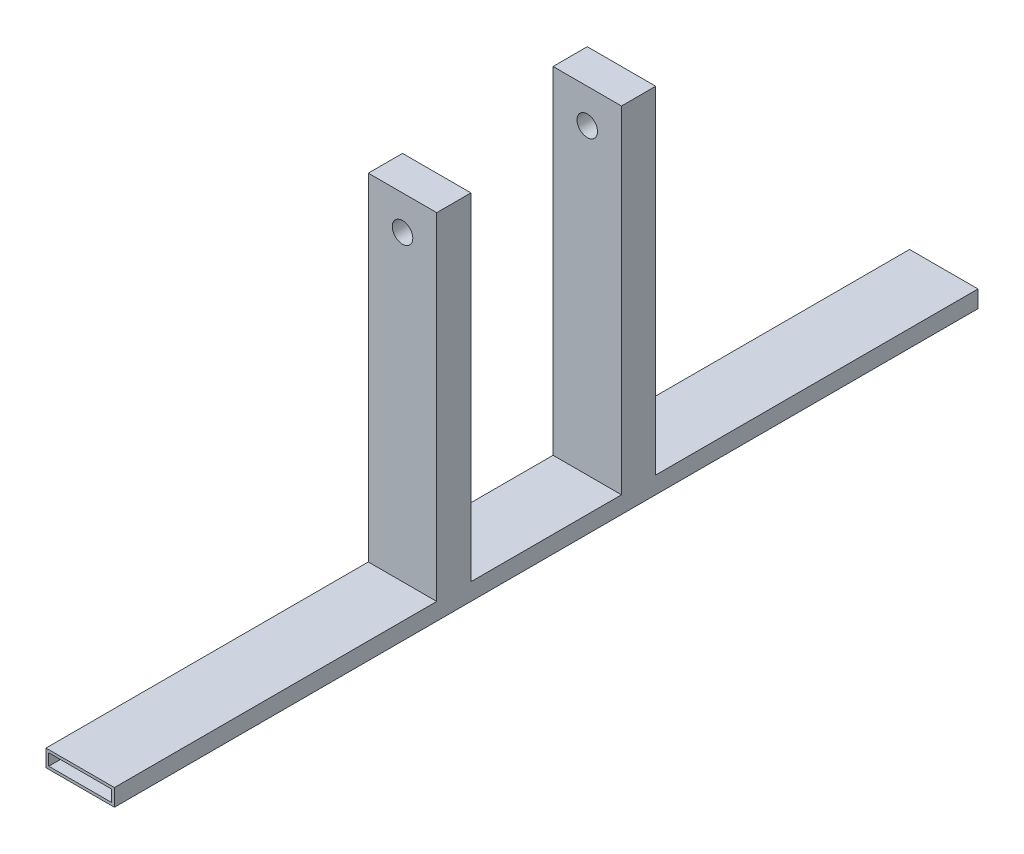
ISO-10303-21;
HEADER;
FILE_DESCRIPTION(('STEP AP214'),'2;1');
FILE_NAME('part.step','',(''),(''),'','','');
FILE_SCHEMA(('AUTOMOTIVE_DESIGN { 1 0 10303 214 1 1 1 1 }'));
ENDSEC;
DATA;
#1=APPLICATION_CONTEXT('core data for automotive mechanical design processes');
#2=APPLICATION_PROTOCOL_DEFINITION('international standard','automotive_design',2000,#1);
#3=PRODUCT_CONTEXT('',#1,'mechanical');
#4=PRODUCT('Part','Part','',(#3));
#5=PRODUCT_RELATED_PRODUCT_CATEGORY('part','',(#4));
#6=PRODUCT_DEFINITION_FORMATION('','',#4);
#7=PRODUCT_DEFINITION_CONTEXT('part definition',#1,'design');
#8=PRODUCT_DEFINITION('design','',#6,#7);
#9=PRODUCT_DEFINITION_SHAPE('','',#8);
#10=(LENGTH_UNIT() NAMED_UNIT(*) SI_UNIT(.MILLI.,.METRE.));
#11=(NAMED_UNIT(*) PLANE_ANGLE_UNIT() SI_UNIT($,.RADIAN.));
#12=(NAMED_UNIT(*) SI_UNIT($,.STERADIAN.) SOLID_ANGLE_UNIT());
#13=UNCERTAINTY_MEASURE_WITH_UNIT(LENGTH_MEASURE(1.E-05),#10,'distance_accuracy_value','');
#14=(GEOMETRIC_REPRESENTATION_CONTEXT(3) GLOBAL_UNCERTAINTY_ASSIGNED_CONTEXT((#13)) GLOBAL_UNIT_ASSIGNED_CONTEXT((#10,
#11,#12)) REPRESENTATION_CONTEXT('',''));
#15=CARTESIAN_POINT('',(0.,0.,0.));
#16=DIRECTION('',(0.,0.,1.));
#17=DIRECTION('',(1.,0.,0.));
#18=AXIS2_PLACEMENT_3D('',#15,#16,#17);
#19=CARTESIAN_POINT('',(-16.6040623260991,3.95833333333333,631.));
#20=DIRECTION('',(0.,-1.,0.));
#21=DIRECTION('',(0.,0.,-1.));
#22=AXIS2_PLACEMENT_3D('',#19,#20,#21);
#23=PLANE('',#22);
#24=DIRECTION('',(1.,0.,0.));
#25=VECTOR('',#24,1.);
#26=CARTESIAN_POINT('',(-16.6040623260991,3.95833333333333,395.5));
#27=LINE('',#26,#25);
#28=CARTESIAN_POINT('',(-16.6040623260991,3.95833333333333,395.5));
#29=VERTEX_POINT('',#28);
#30=CARTESIAN_POINT('',(33.395937673901,3.95833333333333,395.5));
#31=VERTEX_POINT('',#30);
#32=EDGE_CURVE('E59',#29,#31,#27,.T.);
#33=ORIENTED_EDGE('',*,*,#32,.F.);
#34=DIRECTION('',(0.,0.,-1.));
#35=VECTOR('',#34,1.);
#36=CARTESIAN_POINT('',(-16.6040623260991,3.95833333333333,631.));
#37=LINE('',#36,#35);
#38=CARTESIAN_POINT('',(-16.6040623260991,3.95833333333333,631.));
#39=VERTEX_POINT('',#38);
#40=EDGE_CURVE('E221',#39,#29,#37,.T.);
#41=ORIENTED_EDGE('',*,*,#40,.F.);
#42=DIRECTION('',(-1.,0.,0.));
#43=VECTOR('',#42,1.);
#44=CARTESIAN_POINT('',(-16.6040623260991,3.95833333333333,631.));
#45=LINE('',#44,#43);
#46=CARTESIAN_POINT('',(33.395937673901,3.95833333333333,631.));
#47=VERTEX_POINT('',#46);
#48=EDGE_CURVE('E346',#47,#39,#45,.T.);
#49=ORIENTED_EDGE('',*,*,#48,.F.);
#50=DIRECTION('',(0.,0.,-1.));
#51=VECTOR('',#50,1.);
#52=CARTESIAN_POINT('',(33.395937673901,3.95833333333333,631.));
#53=LINE('',#52,#51);
#54=EDGE_CURVE('E361',#47,#31,#53,.T.);
#55=ORIENTED_EDGE('',*,*,#54,.T.);
#56=EDGE_LOOP('',(#33,#41,#49,#55));
#57=FACE_BOUND('',#56,.T.);
#58=ADVANCED_FACE('F35',(#57),#23,.F.);
#59=DIRECTION('',(-1.,0.,0.));
#60=VECTOR('',#59,1.);
#61=CARTESIAN_POINT('',(-16.6040623260991,3.95833333333333,370.5));
#62=LINE('',#61,#60);
#63=CARTESIAN_POINT('',(33.395937673901,3.95833333333333,370.5));
#64=VERTEX_POINT('',#63);
#65=CARTESIAN_POINT('',(-16.6040623260976,3.95833333333331,370.5));
#66=VERTEX_POINT('',#65);
#67=EDGE_CURVE('E239',#64,#66,#62,.T.);
#68=ORIENTED_EDGE('',*,*,#67,.F.);
#69=CARTESIAN_POINT('',(33.395937673901,3.95833333333333,260.5));
#70=VERTEX_POINT('',#69);
#71=EDGE_CURVE('E364',#64,#70,#53,.T.);
#72=ORIENTED_EDGE('',*,*,#71,.T.);
#73=DIRECTION('',(1.,0.,0.));
#74=VECTOR('',#73,1.);
#75=CARTESIAN_POINT('',(-16.6040623260991,3.95833333333333,260.5));
#76=LINE('',#75,#74);
#77=CARTESIAN_POINT('',(-16.6040623260991,3.95833333333333,260.5));
#78=VERTEX_POINT('',#77);
#79=EDGE_CURVE('E294',#78,#70,#76,.T.);
#80=ORIENTED_EDGE('',*,*,#79,.F.);
#81=EDGE_CURVE('E360',#66,#78,#37,.T.);
#82=ORIENTED_EDGE('',*,*,#81,.F.);
#83=EDGE_LOOP('',(#68,#72,#80,#82));
#84=FACE_BOUND('',#83,.T.);
#85=ADVANCED_FACE('F436',(#84),#23,.F.);
#86=CARTESIAN_POINT('',(-14.6040623260991,3.95833333333333,631.));
#87=DIRECTION('',(1.,0.,0.));
#88=DIRECTION('',(0.,0.,-1.));
#89=AXIS2_PLACEMENT_3D('',#86,#87,#88);
#90=PLANE('',#89);
#91=DIRECTION('',(0.,0.,1.));
#92=VECTOR('',#91,1.);
#93=CARTESIAN_POINT('',(-14.6040623260991,0.,631.));
#94=LINE('',#93,#92);
#95=CARTESIAN_POINT('',(-14.6040623260991,0.,370.5));
#96=VERTEX_POINT('',#95);
#97=CARTESIAN_POINT('',(-14.6040623260991,0.,395.5));
#98=VERTEX_POINT('',#97);
#99=EDGE_CURVE('E225',#96,#98,#94,.T.);
#100=ORIENTED_EDGE('',*,*,#99,.T.);
#101=DIRECTION('',(0.,1.,0.));
#102=VECTOR('',#101,1.);
#103=CARTESIAN_POINT('',(-14.6040623260991,3.95833333333333,395.5));
#104=LINE('',#103,#102);
#105=CARTESIAN_POINT('',(-14.6040623260991,1.95833333333333,395.5));
#106=VERTEX_POINT('',#105);
#107=EDGE_CURVE('E248',#98,#106,#104,.T.);
#108=ORIENTED_EDGE('',*,*,#107,.T.);
#109=DIRECTION('',(0.,0.,-1.));
#110=VECTOR('',#109,1.);
#111=CARTESIAN_POINT('',(-14.6040623260991,1.95833333333333,631.));
#112=LINE('',#111,#110);
#113=CARTESIAN_POINT('',(-14.6040623260991,1.95833333333333,631.));
#114=VERTEX_POINT('',#113);
#115=EDGE_CURVE('E306',#114,#106,#112,.T.);
#116=ORIENTED_EDGE('',*,*,#115,.F.);
#117=DIRECTION('',(0.,-1.,0.));
#118=VECTOR('',#117,1.);
#119=CARTESIAN_POINT('',(-14.6040623260991,3.95833333333333,631.));
#120=LINE('',#119,#118);
#121=CARTESIAN_POINT('',(-14.6040623260991,-6.54166655866667,631.));
#122=VERTEX_POINT('',#121);
#123=EDGE_CURVE('E324',#114,#122,#120,.T.);
#124=ORIENTED_EDGE('',*,*,#123,.T.);
#125=DIRECTION('',(0.,0.,-1.));
#126=VECTOR('',#125,1.);
#127=CARTESIAN_POINT('',(-14.6040623260991,-6.54166655866667,631.));
#128=LINE('',#127,#126);
#129=CARTESIAN_POINT('',(-14.6040623260991,-6.54166655866667,0.));
#130=VERTEX_POINT('',#129);
#131=EDGE_CURVE('E301',#122,#130,#128,.T.);
#132=ORIENTED_EDGE('',*,*,#131,.T.);
#133=DIRECTION('',(0.,-1.,0.));
#134=VECTOR('',#133,1.);
#135=CARTESIAN_POINT('',(-14.6040623260991,3.95833333333333,0.));
#136=LINE('',#135,#134);
#137=CARTESIAN_POINT('',(-14.6040623260991,1.95833333333333,0.));
#138=VERTEX_POINT('',#137);
#139=EDGE_CURVE('E300',#138,#130,#136,.T.);
#140=ORIENTED_EDGE('',*,*,#139,.F.);
#141=CARTESIAN_POINT('',(-14.6040623260991,1.95833333333333,235.5));
#142=VERTEX_POINT('',#141);
#143=EDGE_CURVE('E311',#142,#138,#112,.T.);
#144=ORIENTED_EDGE('',*,*,#143,.F.);
#145=DIRECTION('',(0.,-1.,0.));
#146=VECTOR('',#145,1.);
#147=CARTESIAN_POINT('',(-14.6040623260991,3.95833333333333,235.5));
#148=LINE('',#147,#146);
#149=CARTESIAN_POINT('',(-14.6040623260991,0.,235.5));
#150=VERTEX_POINT('',#149);
#151=EDGE_CURVE('E282',#142,#150,#148,.T.);
#152=ORIENTED_EDGE('',*,*,#151,.T.);
#153=DIRECTION('',(0.,0.,1.));
#154=VECTOR('',#153,1.);
#155=CARTESIAN_POINT('',(-14.6040623260991,0.,631.));
#156=LINE('',#155,#154);
#157=CARTESIAN_POINT('',(-14.6040623260991,0.,260.5));
#158=VERTEX_POINT('',#157);
#159=EDGE_CURVE('E297',#150,#158,#156,.T.);
#160=ORIENTED_EDGE('',*,*,#159,.T.);
#161=DIRECTION('',(0.,1.,0.));
#162=VECTOR('',#161,1.);
#163=CARTESIAN_POINT('',(-14.6040623260991,3.95833333333333,260.5));
#164=LINE('',#163,#162);
#165=CARTESIAN_POINT('',(-14.6040623260991,1.95833333333333,260.5));
#166=VERTEX_POINT('',#165);
#167=EDGE_CURVE('E291',#158,#166,#164,.T.);
#168=ORIENTED_EDGE('',*,*,#167,.T.);
#169=CARTESIAN_POINT('',(-14.6040623260991,1.95833333333333,370.5));
#170=VERTEX_POINT('',#169);
#171=EDGE_CURVE('E310',#170,#166,#112,.T.);
#172=ORIENTED_EDGE('',*,*,#171,.F.);
#173=DIRECTION('',(0.,-1.,0.));
#174=VECTOR('',#173,1.);
#175=CARTESIAN_POINT('',(-14.6040623260991,3.95833333333333,370.5));
#176=LINE('',#175,#174);
#177=EDGE_CURVE('E51',#170,#96,#176,.T.);
#178=ORIENTED_EDGE('',*,*,#177,.T.);
#179=EDGE_LOOP('',(#100,#108,#116,#124,#132,#140,#144,#152,#160,#168,#172,#178));
#180=FACE_BOUND('',#179,.T.);
#181=ADVANCED_FACE('F384',(#180),#90,.T.);
#182=CARTESIAN_POINT('',(31.3959376739009,3.95833333333333,631.));
#183=DIRECTION('',(-1.,0.,0.));
#184=DIRECTION('',(0.,0.,1.));
#185=AXIS2_PLACEMENT_3D('',#182,#183,#184);
#186=PLANE('',#185);
#187=DIRECTION('',(0.,0.,-1.));
#188=VECTOR('',#187,1.);
#189=CARTESIAN_POINT('',(31.3959376739009,1.95833333333333,631.));
#190=LINE('',#189,#188);
#191=CARTESIAN_POINT('',(31.3959376739009,1.95833333333333,631.));
#192=VERTEX_POINT('',#191);
#193=CARTESIAN_POINT('',(31.3959376739009,1.95833333333333,395.5));
#194=VERTEX_POINT('',#193);
#195=EDGE_CURVE('E314',#192,#194,#190,.T.);
#196=ORIENTED_EDGE('',*,*,#195,.T.);
#197=DIRECTION('',(0.,-1.,0.));
#198=VECTOR('',#197,1.);
#199=CARTESIAN_POINT('',(31.3959376739009,3.95833333333333,395.5));
#200=LINE('',#199,#198);
#201=CARTESIAN_POINT('',(31.3959376739009,0.,395.5));
#202=VERTEX_POINT('',#201);
#203=EDGE_CURVE('E245',#194,#202,#200,.T.);
#204=ORIENTED_EDGE('',*,*,#203,.T.);
#205=DIRECTION('',(0.,0.,-1.));
#206=VECTOR('',#205,1.);
#207=CARTESIAN_POINT('',(31.3959376739009,0.,631.));
#208=LINE('',#207,#206);
#209=CARTESIAN_POINT('',(31.3959376739009,0.,370.5));
#210=VERTEX_POINT('',#209);
#211=EDGE_CURVE('E222',#202,#210,#208,.T.);
#212=ORIENTED_EDGE('',*,*,#211,.T.);
#213=DIRECTION('',(0.,1.,0.));
#214=VECTOR('',#213,1.);
#215=CARTESIAN_POINT('',(31.3959376739009,3.95833333333333,370.5));
#216=LINE('',#215,#214);
#217=CARTESIAN_POINT('',(31.3959376739009,1.95833333333333,370.5));
#218=VERTEX_POINT('',#217);
#219=EDGE_CURVE('E235',#210,#218,#216,.T.);
#220=ORIENTED_EDGE('',*,*,#219,.T.);
#221=CARTESIAN_POINT('',(31.3959376739009,1.95833333333333,260.5));
#222=VERTEX_POINT('',#221);
#223=EDGE_CURVE('E317',#218,#222,#190,.T.);
#224=ORIENTED_EDGE('',*,*,#223,.T.);
#225=DIRECTION('',(0.,-1.,0.));
#226=VECTOR('',#225,1.);
#227=CARTESIAN_POINT('',(31.3959376739009,3.95833333333333,260.5));
#228=LINE('',#227,#226);
#229=CARTESIAN_POINT('',(31.3959376739009,0.,260.5));
#230=VERTEX_POINT('',#229);
#231=EDGE_CURVE('E288',#222,#230,#228,.T.);
#232=ORIENTED_EDGE('',*,*,#231,.T.);
#233=DIRECTION('',(0.,0.,-1.));
#234=VECTOR('',#233,1.);
#235=CARTESIAN_POINT('',(31.3959376739009,0.,631.));
#236=LINE('',#235,#234);
#237=CARTESIAN_POINT('',(31.3959376739009,0.,235.5));
#238=VERTEX_POINT('',#237);
#239=EDGE_CURVE('E11',#230,#238,#236,.T.);
#240=ORIENTED_EDGE('',*,*,#239,.T.);
#241=DIRECTION('',(0.,1.,0.));
#242=VECTOR('',#241,1.);
#243=CARTESIAN_POINT('',(31.3959376739009,3.95833333333333,235.5));
#244=LINE('',#243,#242);
#245=CARTESIAN_POINT('',(31.3959376739009,1.95833333333333,235.5));
#246=VERTEX_POINT('',#245);
#247=EDGE_CURVE('E279',#238,#246,#244,.T.);
#248=ORIENTED_EDGE('',*,*,#247,.T.);
#249=CARTESIAN_POINT('',(31.3959376739009,1.95833333333333,0.));
#250=VERTEX_POINT('',#249);
#251=EDGE_CURVE('E309',#246,#250,#190,.T.);
#252=ORIENTED_EDGE('',*,*,#251,.T.);
#253=DIRECTION('',(0.,1.,0.));
#254=VECTOR('',#253,1.);
#255=CARTESIAN_POINT('',(31.3959376739009,3.95833333333333,0.));
#256=LINE('',#255,#254);
#257=CARTESIAN_POINT('',(31.3959376739009,-6.54166655866667,0.));
#258=VERTEX_POINT('',#257);
#259=EDGE_CURVE('E325',#258,#250,#256,.T.);
#260=ORIENTED_EDGE('',*,*,#259,.F.);
#261=DIRECTION('',(0.,0.,-1.));
#262=VECTOR('',#261,1.);
#263=CARTESIAN_POINT('',(31.3959376739009,-6.54166655866667,631.));
#264=LINE('',#263,#262);
#265=CARTESIAN_POINT('',(31.3959376739009,-6.54166655866667,631.));
#266=VERTEX_POINT('',#265);
#267=EDGE_CURVE('E305',#266,#258,#264,.T.);
#268=ORIENTED_EDGE('',*,*,#267,.F.);
#269=DIRECTION('',(0.,1.,0.));
#270=VECTOR('',#269,1.);
#271=CARTESIAN_POINT('',(31.3959376739009,3.95833333333333,631.));
#272=LINE('',#271,#270);
#273=EDGE_CURVE('E333',#266,#192,#272,.T.);
#274=ORIENTED_EDGE('',*,*,#273,.T.);
#275=EDGE_LOOP('',(#196,#204,#212,#220,#224,#232,#240,#248,#252,#260,#268,#274));
#276=FACE_BOUND('',#275,.T.);
#277=ADVANCED_FACE('F393',(#276),#186,.T.);
#278=CARTESIAN_POINT('',(-16.6040623260991,1.95833333333333,631.));
#279=DIRECTION('',(0.,-1.,0.));
#280=DIRECTION('',(0.,0.,-1.));
#281=AXIS2_PLACEMENT_3D('',#278,#279,#280);
#282=PLANE('',#281);
#283=ORIENTED_EDGE('',*,*,#115,.T.);
#284=DIRECTION('',(1.,0.,0.));
#285=VECTOR('',#284,1.);
#286=CARTESIAN_POINT('',(-16.6040623260991,1.95833333333333,395.5));
#287=LINE('',#286,#285);
#288=EDGE_CURVE('E242',#106,#194,#287,.T.);
#289=ORIENTED_EDGE('',*,*,#288,.T.);
#290=ORIENTED_EDGE('',*,*,#195,.F.);
#291=DIRECTION('',(-1.,0.,0.));
#292=VECTOR('',#291,1.);
#293=CARTESIAN_POINT('',(-16.6040623260991,1.95833333333333,631.));
#294=LINE('',#293,#292);
#295=EDGE_CURVE('E336',#192,#114,#294,.T.);
#296=ORIENTED_EDGE('',*,*,#295,.T.);
#297=EDGE_LOOP('',(#283,#289,#290,#296));
#298=FACE_BOUND('',#297,.T.);
#299=ADVANCED_FACE('F472',(#298),#282,.T.);
#300=ORIENTED_EDGE('',*,*,#223,.F.);
#301=DIRECTION('',(-1.,0.,0.));
#302=VECTOR('',#301,1.);
#303=CARTESIAN_POINT('',(-16.6040623260991,1.95833333333333,370.5));
#304=LINE('',#303,#302);
#305=EDGE_CURVE('E233',#218,#170,#304,.T.);
#306=ORIENTED_EDGE('',*,*,#305,.T.);
#307=ORIENTED_EDGE('',*,*,#171,.T.);
#308=DIRECTION('',(1.,0.,0.));
#309=VECTOR('',#308,1.);
#310=CARTESIAN_POINT('',(-16.6040623260991,1.95833333333333,260.5));
#311=LINE('',#310,#309);
#312=EDGE_CURVE('E44',#166,#222,#311,.T.);
#313=ORIENTED_EDGE('',*,*,#312,.T.);
#314=EDGE_LOOP('',(#300,#306,#307,#313));
#315=FACE_BOUND('',#314,.T.);
#316=ADVANCED_FACE('F377',(#315),#282,.T.);
#317=DIRECTION('',(-1.,0.,0.));
#318=VECTOR('',#317,1.);
#319=CARTESIAN_POINT('',(-16.6040623260991,3.95833333333333,235.5));
#320=LINE('',#319,#318);
#321=CARTESIAN_POINT('',(33.395937673901,3.95833333333333,235.5));
#322=VERTEX_POINT('',#321);
#323=CARTESIAN_POINT('',(-16.6040623260991,3.95833333333331,235.5));
#324=VERTEX_POINT('',#323);
#325=EDGE_CURVE('E285',#322,#324,#320,.T.);
#326=ORIENTED_EDGE('',*,*,#325,.F.);
#327=CARTESIAN_POINT('',(33.395937673901,3.95833333333333,0.));
#328=VERTEX_POINT('',#327);
#329=EDGE_CURVE('E359',#322,#328,#53,.T.);
#330=ORIENTED_EDGE('',*,*,#329,.T.);
#331=DIRECTION('',(-1.,0.,0.));
#332=VECTOR('',#331,1.);
#333=CARTESIAN_POINT('',(-16.6040623260991,3.95833333333333,0.));
#334=LINE('',#333,#332);
#335=CARTESIAN_POINT('',(-16.6040623260991,3.95833333333333,0.));
#336=VERTEX_POINT('',#335);
#337=EDGE_CURVE('E342',#328,#336,#334,.T.);
#338=ORIENTED_EDGE('',*,*,#337,.T.);
#339=EDGE_CURVE('E348',#324,#336,#37,.T.);
#340=ORIENTED_EDGE('',*,*,#339,.F.);
#341=EDGE_LOOP('',(#326,#330,#338,#340));
#342=FACE_BOUND('',#341,.T.);
#343=ADVANCED_FACE('F423',(#342),#23,.F.);
#344=ORIENTED_EDGE('',*,*,#251,.F.);
#345=DIRECTION('',(-1.,0.,0.));
#346=VECTOR('',#345,1.);
#347=CARTESIAN_POINT('',(-16.6040623260991,1.95833333333333,235.5));
#348=LINE('',#347,#346);
#349=EDGE_CURVE('E370',#246,#142,#348,.T.);
#350=ORIENTED_EDGE('',*,*,#349,.T.);
#351=ORIENTED_EDGE('',*,*,#143,.T.);
#352=DIRECTION('',(-1.,0.,0.));
#353=VECTOR('',#352,1.);
#354=CARTESIAN_POINT('',(-16.6040623260991,1.95833333333333,0.));
#355=LINE('',#354,#353);
#356=EDGE_CURVE('E321',#250,#138,#355,.T.);
#357=ORIENTED_EDGE('',*,*,#356,.F.);
#358=EDGE_LOOP('',(#344,#350,#351,#357));
#359=FACE_BOUND('',#358,.T.);
#360=ADVANCED_FACE('F396',(#359),#282,.T.);
#361=CARTESIAN_POINT('',(-16.6040623260991,3.95833333333333,631.));
#362=DIRECTION('',(1.,0.,0.));
#363=DIRECTION('',(0.,0.,-1.));
#364=AXIS2_PLACEMENT_3D('',#361,#362,#363);
#365=PLANE('',#364);
#366=ORIENTED_EDGE('',*,*,#40,.T.);
#367=DIRECTION('',(0.,-1.,0.));
#368=VECTOR('',#367,1.);
#369=CARTESIAN_POINT('',(-16.6040623260976,250.,395.5));
#370=LINE('',#369,#368);
#371=CARTESIAN_POINT('',(-16.6040623260976,250.,395.5));
#372=VERTEX_POINT('',#371);
#373=EDGE_CURVE('E203',#372,#29,#370,.T.);
#374=ORIENTED_EDGE('',*,*,#373,.F.);
#375=DIRECTION('',(0.,0.,1.));
#376=VECTOR('',#375,1.);
#377=CARTESIAN_POINT('',(-16.6040623260976,250.,370.5));
#378=LINE('',#377,#376);
#379=CARTESIAN_POINT('',(-16.6040623260976,250.,370.5));
#380=VERTEX_POINT('',#379);
#381=EDGE_CURVE('E209',#380,#372,#378,.T.);
#382=ORIENTED_EDGE('',*,*,#381,.F.);
#383=DIRECTION('',(0.,-1.,0.));
#384=VECTOR('',#383,1.);
#385=CARTESIAN_POINT('',(-16.6040623260976,250.,370.5));
#386=LINE('',#385,#384);
#387=EDGE_CURVE('E409',#380,#66,#386,.T.);
#388=ORIENTED_EDGE('',*,*,#387,.T.);
#389=ORIENTED_EDGE('',*,*,#81,.T.);
#390=DIRECTION('',(0.,-1.,0.));
#391=VECTOR('',#390,1.);
#392=CARTESIAN_POINT('',(-16.6040623260991,250.,260.5));
#393=LINE('',#392,#391);
#394=CARTESIAN_POINT('',(-16.6040623260991,250.,260.5));
#395=VERTEX_POINT('',#394);
#396=EDGE_CURVE('E276',#395,#78,#393,.T.);
#397=ORIENTED_EDGE('',*,*,#396,.F.);
#398=DIRECTION('',(0.,0.,1.));
#399=VECTOR('',#398,1.);
#400=CARTESIAN_POINT('',(-16.6040623260991,250.,235.5));
#401=LINE('',#400,#399);
#402=CARTESIAN_POINT('',(-16.6040623260991,250.,235.5));
#403=VERTEX_POINT('',#402);
#404=EDGE_CURVE('E253',#403,#395,#401,.T.);
#405=ORIENTED_EDGE('',*,*,#404,.F.);
#406=DIRECTION('',(0.,-1.,0.));
#407=VECTOR('',#406,1.);
#408=CARTESIAN_POINT('',(-16.6040623260991,250.,235.5));
#409=LINE('',#408,#407);
#410=EDGE_CURVE('E263',#403,#324,#409,.T.);
#411=ORIENTED_EDGE('',*,*,#410,.T.);
#412=ORIENTED_EDGE('',*,*,#339,.T.);
#413=DIRECTION('',(0.,-1.,0.));
#414=VECTOR('',#413,1.);
#415=CARTESIAN_POINT('',(-16.6040623260991,3.95833333333333,0.));
#416=LINE('',#415,#414);
#417=CARTESIAN_POINT('',(-16.6040623260991,-8.54166655866667,0.));
#418=VERTEX_POINT('',#417);
#419=EDGE_CURVE('E304',#336,#418,#416,.T.);
#420=ORIENTED_EDGE('',*,*,#419,.T.);
#421=DIRECTION('',(0.,0.,-1.));
#422=VECTOR('',#421,1.);
#423=CARTESIAN_POINT('',(-16.6040623260991,-8.54166655866667,631.));
#424=LINE('',#423,#422);
#425=CARTESIAN_POINT('',(-16.6040623260991,-8.54166655866667,631.));
#426=VERTEX_POINT('',#425);
#427=EDGE_CURVE('E367',#426,#418,#424,.T.);
#428=ORIENTED_EDGE('',*,*,#427,.F.);
#429=DIRECTION('',(0.,-1.,0.));
#430=VECTOR('',#429,1.);
#431=CARTESIAN_POINT('',(-16.6040623260991,3.95833333333333,631.));
#432=LINE('',#431,#430);
#433=EDGE_CURVE('E338',#39,#426,#432,.T.);
#434=ORIENTED_EDGE('',*,*,#433,.F.);
#435=EDGE_LOOP('',(#366,#374,#382,#388,#389,#397,#405,#411,#412,#420,#428,#434));
#436=FACE_BOUND('',#435,.T.);
#437=ADVANCED_FACE('F37',(#436),#365,.F.);
#438=CARTESIAN_POINT('',(-16.6040623260991,-8.54166655866667,631.));
#439=DIRECTION('',(0.,1.,0.));
#440=DIRECTION('',(0.,0.,1.));
#441=AXIS2_PLACEMENT_3D('',#438,#439,#440);
#442=PLANE('',#441);
#443=DIRECTION('',(1.,0.,0.));
#444=VECTOR('',#443,1.);
#445=CARTESIAN_POINT('',(-16.6040623260991,-8.54166655866667,0.));
#446=LINE('',#445,#444);
#447=CARTESIAN_POINT('',(33.395937673901,-8.54166655866667,0.));
#448=VERTEX_POINT('',#447);
#449=EDGE_CURVE('E351',#418,#448,#446,.T.);
#450=ORIENTED_EDGE('',*,*,#449,.T.);
#451=DIRECTION('',(0.,0.,-1.));
#452=VECTOR('',#451,1.);
#453=CARTESIAN_POINT('',(33.395937673901,-8.54166655866667,631.));
#454=LINE('',#453,#452);
#455=CARTESIAN_POINT('',(33.395937673901,-8.54166655866667,631.));
#456=VERTEX_POINT('',#455);
#457=EDGE_CURVE('E363',#456,#448,#454,.T.);
#458=ORIENTED_EDGE('',*,*,#457,.F.);
#459=DIRECTION('',(1.,0.,0.));
#460=VECTOR('',#459,1.);
#461=CARTESIAN_POINT('',(-16.6040623260991,-8.54166655866667,631.));
#462=LINE('',#461,#460);
#463=EDGE_CURVE('E341',#426,#456,#462,.T.);
#464=ORIENTED_EDGE('',*,*,#463,.F.);
#465=ORIENTED_EDGE('',*,*,#427,.T.);
#466=EDGE_LOOP('',(#450,#458,#464,#465));
#467=FACE_BOUND('',#466,.T.);
#468=ADVANCED_FACE('F595',(#467),#442,.F.);
#469=CARTESIAN_POINT('',(33.395937673901,3.95833333333333,631.));
#470=DIRECTION('',(-1.,0.,0.));
#471=DIRECTION('',(0.,0.,1.));
#472=AXIS2_PLACEMENT_3D('',#469,#470,#471);
#473=PLANE('',#472);
#474=ORIENTED_EDGE('',*,*,#71,.F.);
#475=DIRECTION('',(0.,-1.,0.));
#476=VECTOR('',#475,1.);
#477=CARTESIAN_POINT('',(33.3959376739024,250.,370.5));
#478=LINE('',#477,#476);
#479=CARTESIAN_POINT('',(33.3959376739024,250.,370.5));
#480=VERTEX_POINT('',#479);
#481=EDGE_CURVE('E227',#480,#64,#478,.T.);
#482=ORIENTED_EDGE('',*,*,#481,.F.);
#483=DIRECTION('',(0.,0.,-1.));
#484=VECTOR('',#483,1.);
#485=CARTESIAN_POINT('',(33.3959376739024,250.,370.5));
#486=LINE('',#485,#484);
#487=CARTESIAN_POINT('',(33.3959376739024,250.,395.5));
#488=VERTEX_POINT('',#487);
#489=EDGE_CURVE('E208',#488,#480,#486,.T.);
#490=ORIENTED_EDGE('',*,*,#489,.F.);
#491=DIRECTION('',(0.,-1.,0.));
#492=VECTOR('',#491,1.);
#493=CARTESIAN_POINT('',(33.3959376739024,250.,395.5));
#494=LINE('',#493,#492);
#495=EDGE_CURVE('E205',#488,#31,#494,.T.);
#496=ORIENTED_EDGE('',*,*,#495,.T.);
#497=ORIENTED_EDGE('',*,*,#54,.F.);
#498=DIRECTION('',(0.,1.,0.));
#499=VECTOR('',#498,1.);
#500=CARTESIAN_POINT('',(33.395937673901,3.95833333333333,631.));
#501=LINE('',#500,#499);
#502=EDGE_CURVE('E344',#456,#47,#501,.T.);
#503=ORIENTED_EDGE('',*,*,#502,.F.);
#504=ORIENTED_EDGE('',*,*,#457,.T.);
#505=DIRECTION('',(0.,1.,0.));
#506=VECTOR('',#505,1.);
#507=CARTESIAN_POINT('',(33.395937673901,3.95833333333333,0.));
#508=LINE('',#507,#506);
#509=EDGE_CURVE('E353',#448,#328,#508,.T.);
#510=ORIENTED_EDGE('',*,*,#509,.T.);
#511=ORIENTED_EDGE('',*,*,#329,.F.);
#512=DIRECTION('',(0.,-1.,0.));
#513=VECTOR('',#512,1.);
#514=CARTESIAN_POINT('',(33.3959376739009,250.,235.5));
#515=LINE('',#514,#513);
#516=CARTESIAN_POINT('',(33.3959376739009,250.,235.5));
#517=VERTEX_POINT('',#516);
#518=EDGE_CURVE('E270',#517,#322,#515,.T.);
#519=ORIENTED_EDGE('',*,*,#518,.F.);
#520=DIRECTION('',(0.,0.,-1.));
#521=VECTOR('',#520,1.);
#522=CARTESIAN_POINT('',(33.3959376739009,250.,235.5));
#523=LINE('',#522,#521);
#524=CARTESIAN_POINT('',(33.395937673901,250.,260.5));
#525=VERTEX_POINT('',#524);
#526=EDGE_CURVE('E259',#525,#517,#523,.T.);
#527=ORIENTED_EDGE('',*,*,#526,.F.);
#528=DIRECTION('',(0.,-1.,0.));
#529=VECTOR('',#528,1.);
#530=CARTESIAN_POINT('',(33.395937673901,250.,260.5));
#531=LINE('',#530,#529);
#532=EDGE_CURVE('E273',#525,#70,#531,.T.);
#533=ORIENTED_EDGE('',*,*,#532,.T.);
#534=EDGE_LOOP('',(#474,#482,#490,#496,#497,#503,#504,#510,#511,#519,#527,#533));
#535=FACE_BOUND('',#534,.T.);
#536=ADVANCED_FACE('F416',(#535),#473,.F.);
#537=CARTESIAN_POINT('',(0.,0.,631.));
#538=DIRECTION('',(0.,0.,1.));
#539=DIRECTION('',(1.,0.,0.));
#540=AXIS2_PLACEMENT_3D('',#537,#538,#539);
#541=PLANE('',#540);
#542=ORIENTED_EDGE('',*,*,#123,.F.);
#543=ORIENTED_EDGE('',*,*,#295,.F.);
#544=ORIENTED_EDGE('',*,*,#273,.F.);
#545=DIRECTION('',(1.,0.,0.));
#546=VECTOR('',#545,1.);
#547=CARTESIAN_POINT('',(-16.6040623260991,-6.54166655866667,631.));
#548=LINE('',#547,#546);
#549=EDGE_CURVE('E331',#122,#266,#548,.T.);
#550=ORIENTED_EDGE('',*,*,#549,.F.);
#551=EDGE_LOOP('',(#542,#543,#544,#550));
#552=FACE_BOUND('',#551,.T.);
#553=ORIENTED_EDGE('',*,*,#433,.T.);
#554=ORIENTED_EDGE('',*,*,#463,.T.);
#555=ORIENTED_EDGE('',*,*,#502,.T.);
#556=ORIENTED_EDGE('',*,*,#48,.T.);
#557=EDGE_LOOP('',(#553,#554,#555,#556));
#558=FACE_BOUND('',#557,.T.);
#559=ADVANCED_FACE('F480',(#552,#558),#541,.T.);
#560=CARTESIAN_POINT('',(0.,0.,0.));
#561=DIRECTION('',(0.,0.,1.));
#562=DIRECTION('',(1.,0.,0.));
#563=AXIS2_PLACEMENT_3D('',#560,#561,#562);
#564=PLANE('',#563);
#565=ORIENTED_EDGE('',*,*,#356,.T.);
#566=ORIENTED_EDGE('',*,*,#139,.T.);
#567=DIRECTION('',(1.,0.,0.));
#568=VECTOR('',#567,1.);
#569=CARTESIAN_POINT('',(-16.6040623260991,-6.54166655866667,0.));
#570=LINE('',#569,#568);
#571=EDGE_CURVE('E320',#130,#258,#570,.T.);
#572=ORIENTED_EDGE('',*,*,#571,.T.);
#573=ORIENTED_EDGE('',*,*,#259,.T.);
#574=EDGE_LOOP('',(#565,#566,#572,#573));
#575=FACE_BOUND('',#574,.T.);
#576=ORIENTED_EDGE('',*,*,#419,.F.);
#577=ORIENTED_EDGE('',*,*,#337,.F.);
#578=ORIENTED_EDGE('',*,*,#509,.F.);
#579=ORIENTED_EDGE('',*,*,#449,.F.);
#580=EDGE_LOOP('',(#576,#577,#578,#579));
#581=FACE_BOUND('',#580,.T.);
#582=ADVANCED_FACE('F431',(#575,#581),#564,.F.);
#583=CARTESIAN_POINT('',(-16.6040623260991,-6.54166655866667,631.));
#584=DIRECTION('',(0.,1.,0.));
#585=DIRECTION('',(0.,0.,1.));
#586=AXIS2_PLACEMENT_3D('',#583,#584,#585);
#587=PLANE('',#586);
#588=ORIENTED_EDGE('',*,*,#571,.F.);
#589=ORIENTED_EDGE('',*,*,#131,.F.);
#590=ORIENTED_EDGE('',*,*,#549,.T.);
#591=ORIENTED_EDGE('',*,*,#267,.T.);
#592=EDGE_LOOP('',(#588,#589,#590,#591));
#593=FACE_BOUND('',#592,.T.);
#594=ADVANCED_FACE('F484',(#593),#587,.T.);
#595=CARTESIAN_POINT('',(-16.6040623260991,250.,260.5));
#596=DIRECTION('',(0.,0.,-1.));
#597=DIRECTION('',(-1.,0.,0.));
#598=AXIS2_PLACEMENT_3D('',#595,#596,#597);
#599=PLANE('',#598);
#600=ORIENTED_EDGE('',*,*,#167,.F.);
#601=DIRECTION('',(1.,0.,0.));
#602=VECTOR('',#601,1.);
#603=CARTESIAN_POINT('',(-16.6040623260991,0.,260.5));
#604=LINE('',#603,#602);
#605=EDGE_CURVE('E252',#158,#230,#604,.T.);
#606=ORIENTED_EDGE('',*,*,#605,.T.);
#607=ORIENTED_EDGE('',*,*,#231,.F.);
#608=ORIENTED_EDGE('',*,*,#312,.F.);
#609=EDGE_LOOP('',(#600,#606,#607,#608));
#610=FACE_BOUND('',#609,.T.);
#611=ADVANCED_FACE('F381',(#610),#599,.F.);
#612=CARTESIAN_POINT('',(-16.6040623260991,250.,235.5));
#613=DIRECTION('',(0.,0.,1.));
#614=DIRECTION('',(1.,0.,0.));
#615=AXIS2_PLACEMENT_3D('',#612,#613,#614);
#616=PLANE('',#615);
#617=ORIENTED_EDGE('',*,*,#151,.F.);
#618=ORIENTED_EDGE('',*,*,#349,.F.);
#619=ORIENTED_EDGE('',*,*,#247,.F.);
#620=DIRECTION('',(-1.,0.,0.));
#621=VECTOR('',#620,1.);
#622=CARTESIAN_POINT('',(-16.6040623260991,0.,235.5));
#623=LINE('',#622,#621);
#624=EDGE_CURVE('E257',#238,#150,#623,.T.);
#625=ORIENTED_EDGE('',*,*,#624,.T.);
#626=EDGE_LOOP('',(#617,#618,#619,#625));
#627=FACE_BOUND('',#626,.T.);
#628=ADVANCED_FACE('F390',(#627),#616,.F.);
#629=CARTESIAN_POINT('',(0.,0.,0.));
#630=DIRECTION('',(0.,1.,0.));
#631=DIRECTION('',(0.,0.,1.));
#632=AXIS2_PLACEMENT_3D('',#629,#630,#631);
#633=PLANE('',#632);
#634=ORIENTED_EDGE('',*,*,#159,.F.);
#635=ORIENTED_EDGE('',*,*,#624,.F.);
#636=ORIENTED_EDGE('',*,*,#239,.F.);
#637=ORIENTED_EDGE('',*,*,#605,.F.);
#638=EDGE_LOOP('',(#634,#635,#636,#637));
#639=FACE_BOUND('',#638,.T.);
#640=ADVANCED_FACE('F388',(#639),#633,.F.);
#641=CARTESIAN_POINT('',(8.39593767390095,225.,260.5));
#642=DIRECTION('',(0.,0.,-1.));
#643=DIRECTION('',(-1.,0.,0.));
#644=AXIS2_PLACEMENT_3D('',#641,#642,#643);
#645=CIRCLE('',#644,7.50000000000001);
#646=CARTESIAN_POINT('',(0.895937673900942,225.,260.5));
#647=VERTEX_POINT('',#646);
#648=EDGE_CURVE('E405',#647,#647,#645,.T.);
#649=ORIENTED_EDGE('',*,*,#648,.T.);
#650=EDGE_LOOP('',(#649));
#651=FACE_BOUND('',#650,.T.);
#652=ORIENTED_EDGE('',*,*,#396,.T.);
#653=ORIENTED_EDGE('',*,*,#79,.T.);
#654=ORIENTED_EDGE('',*,*,#532,.F.);
#655=DIRECTION('',(1.,0.,0.));
#656=VECTOR('',#655,1.);
#657=CARTESIAN_POINT('',(-16.6040623260991,250.,260.5));
#658=LINE('',#657,#656);
#659=EDGE_CURVE('E256',#395,#525,#658,.T.);
#660=ORIENTED_EDGE('',*,*,#659,.F.);
#661=EDGE_LOOP('',(#652,#653,#654,#660));
#662=FACE_BOUND('',#661,.T.);
#663=ADVANCED_FACE('F438',(#651,#662),#599,.F.);
#664=CARTESIAN_POINT('',(8.39593767390095,225.,235.5));
#665=DIRECTION('',(0.,0.,1.));
#666=DIRECTION('',(1.,0.,0.));
#667=AXIS2_PLACEMENT_3D('',#664,#665,#666);
#668=CIRCLE('',#667,7.50000000000001);
#669=CARTESIAN_POINT('',(15.895937673901,225.,235.5));
#670=VERTEX_POINT('',#669);
#671=EDGE_CURVE('E518',#670,#670,#668,.T.);
#672=ORIENTED_EDGE('',*,*,#671,.T.);
#673=EDGE_LOOP('',(#672));
#674=FACE_BOUND('',#673,.T.);
#675=ORIENTED_EDGE('',*,*,#518,.T.);
#676=ORIENTED_EDGE('',*,*,#325,.T.);
#677=ORIENTED_EDGE('',*,*,#410,.F.);
#678=DIRECTION('',(-1.,0.,0.));
#679=VECTOR('',#678,1.);
#680=CARTESIAN_POINT('',(-16.6040623260991,250.,235.5));
#681=LINE('',#680,#679);
#682=EDGE_CURVE('E261',#517,#403,#681,.T.);
#683=ORIENTED_EDGE('',*,*,#682,.F.);
#684=EDGE_LOOP('',(#675,#676,#677,#683));
#685=FACE_BOUND('',#684,.T.);
#686=ADVANCED_FACE('F443',(#674,#685),#616,.F.);
#687=CARTESIAN_POINT('',(0.,250.,0.));
#688=DIRECTION('',(0.,1.,0.));
#689=DIRECTION('',(0.,0.,1.));
#690=AXIS2_PLACEMENT_3D('',#687,#688,#689);
#691=PLANE('',#690);
#692=ORIENTED_EDGE('',*,*,#404,.T.);
#693=ORIENTED_EDGE('',*,*,#659,.T.);
#694=ORIENTED_EDGE('',*,*,#526,.T.);
#695=ORIENTED_EDGE('',*,*,#682,.T.);
#696=EDGE_LOOP('',(#692,#693,#694,#695));
#697=FACE_BOUND('',#696,.T.);
#698=ADVANCED_FACE('F440',(#697),#691,.T.);
#699=CARTESIAN_POINT('',(-16.6040623260976,250.,395.5));
#700=DIRECTION('',(0.,0.,-1.));
#701=DIRECTION('',(-1.,0.,0.));
#702=AXIS2_PLACEMENT_3D('',#699,#700,#701);
#703=PLANE('',#702);
#704=ORIENTED_EDGE('',*,*,#107,.F.);
#705=DIRECTION('',(1.,0.,0.));
#706=VECTOR('',#705,1.);
#707=CARTESIAN_POINT('',(-16.6040623260976,0.,395.5));
#708=LINE('',#707,#706);
#709=EDGE_CURVE('E403',#98,#202,#708,.T.);
#710=ORIENTED_EDGE('',*,*,#709,.T.);
#711=ORIENTED_EDGE('',*,*,#203,.F.);
#712=ORIENTED_EDGE('',*,*,#288,.F.);
#713=EDGE_LOOP('',(#704,#710,#711,#712));
#714=FACE_BOUND('',#713,.T.);
#715=ADVANCED_FACE('F451',(#714),#703,.F.);
#716=CARTESIAN_POINT('',(-16.6040623260976,250.,370.5));
#717=DIRECTION('',(0.,0.,1.));
#718=DIRECTION('',(1.,0.,0.));
#719=AXIS2_PLACEMENT_3D('',#716,#717,#718);
#720=PLANE('',#719);
#721=ORIENTED_EDGE('',*,*,#177,.F.);
#722=ORIENTED_EDGE('',*,*,#305,.F.);
#723=ORIENTED_EDGE('',*,*,#219,.F.);
#724=DIRECTION('',(-1.,0.,0.));
#725=VECTOR('',#724,1.);
#726=CARTESIAN_POINT('',(-16.6040623260976,0.,370.5));
#727=LINE('',#726,#725);
#728=EDGE_CURVE('E218',#210,#96,#727,.T.);
#729=ORIENTED_EDGE('',*,*,#728,.T.);
#730=EDGE_LOOP('',(#721,#722,#723,#729));
#731=FACE_BOUND('',#730,.T.);
#732=ADVANCED_FACE('F398',(#731),#720,.F.);
#733=CARTESIAN_POINT('',(0.,0.,0.));
#734=DIRECTION('',(0.,1.,0.));
#735=DIRECTION('',(0.,0.,1.));
#736=AXIS2_PLACEMENT_3D('',#733,#734,#735);
#737=PLANE('',#736);
#738=ORIENTED_EDGE('',*,*,#99,.F.);
#739=ORIENTED_EDGE('',*,*,#728,.F.);
#740=ORIENTED_EDGE('',*,*,#211,.F.);
#741=ORIENTED_EDGE('',*,*,#709,.F.);
#742=EDGE_LOOP('',(#738,#739,#740,#741));
#743=FACE_BOUND('',#742,.T.);
#744=ADVANCED_FACE('F400',(#743),#737,.F.);
#745=CARTESIAN_POINT('',(8.39593767390095,225.,395.5));
#746=DIRECTION('',(0.,0.,-1.));
#747=DIRECTION('',(-1.,0.,0.));
#748=AXIS2_PLACEMENT_3D('',#745,#746,#747);
#749=CIRCLE('',#748,7.50000000000001);
#750=CARTESIAN_POINT('',(0.895937673900942,225.,395.5));
#751=VERTEX_POINT('',#750);
#752=EDGE_CURVE('E516',#751,#751,#749,.T.);
#753=ORIENTED_EDGE('',*,*,#752,.T.);
#754=EDGE_LOOP('',(#753));
#755=FACE_BOUND('',#754,.T.);
#756=ORIENTED_EDGE('',*,*,#373,.T.);
#757=ORIENTED_EDGE('',*,*,#32,.T.);
#758=ORIENTED_EDGE('',*,*,#495,.F.);
#759=DIRECTION('',(1.,0.,0.));
#760=VECTOR('',#759,1.);
#761=CARTESIAN_POINT('',(-16.6040623260976,250.,395.5));
#762=LINE('',#761,#760);
#763=EDGE_CURVE('E199',#372,#488,#762,.T.);
#764=ORIENTED_EDGE('',*,*,#763,.F.);
#765=EDGE_LOOP('',(#756,#757,#758,#764));
#766=FACE_BOUND('',#765,.T.);
#767=ADVANCED_FACE('F201',(#755,#766),#703,.F.);
#768=CARTESIAN_POINT('',(8.39593767390095,225.,370.5));
#769=DIRECTION('',(0.,0.,1.));
#770=DIRECTION('',(1.,0.,0.));
#771=AXIS2_PLACEMENT_3D('',#768,#769,#770);
#772=CIRCLE('',#771,7.50000000000001);
#773=CARTESIAN_POINT('',(15.895937673901,225.,370.5));
#774=VERTEX_POINT('',#773);
#775=EDGE_CURVE('E39',#774,#774,#772,.T.);
#776=ORIENTED_EDGE('',*,*,#775,.T.);
#777=EDGE_LOOP('',(#776));
#778=FACE_BOUND('',#777,.T.);
#779=ORIENTED_EDGE('',*,*,#481,.T.);
#780=ORIENTED_EDGE('',*,*,#67,.T.);
#781=ORIENTED_EDGE('',*,*,#387,.F.);
#782=DIRECTION('',(-1.,0.,0.));
#783=VECTOR('',#782,1.);
#784=CARTESIAN_POINT('',(-16.6040623260976,250.,370.5));
#785=LINE('',#784,#783);
#786=EDGE_CURVE('E214',#480,#380,#785,.T.);
#787=ORIENTED_EDGE('',*,*,#786,.F.);
#788=EDGE_LOOP('',(#779,#780,#781,#787));
#789=FACE_BOUND('',#788,.T.);
#790=ADVANCED_FACE('F413',(#778,#789),#720,.F.);
#791=CARTESIAN_POINT('',(0.,250.,0.));
#792=DIRECTION('',(0.,1.,0.));
#793=DIRECTION('',(0.,0.,1.));
#794=AXIS2_PLACEMENT_3D('',#791,#792,#793);
#795=PLANE('',#794);
#796=ORIENTED_EDGE('',*,*,#381,.T.);
#797=ORIENTED_EDGE('',*,*,#763,.T.);
#798=ORIENTED_EDGE('',*,*,#489,.T.);
#799=ORIENTED_EDGE('',*,*,#786,.T.);
#800=EDGE_LOOP('',(#796,#797,#798,#799));
#801=FACE_BOUND('',#800,.T.);
#802=ADVANCED_FACE('F212',(#801),#795,.T.);
#803=CARTESIAN_POINT('',(8.39593767390095,225.,631.));
#804=DIRECTION('',(0.,0.,-1.));
#805=DIRECTION('',(-1.,0.,0.));
#806=AXIS2_PLACEMENT_3D('',#803,#804,#805);
#807=CYLINDRICAL_SURFACE('',#806,7.50000000000001);
#808=ORIENTED_EDGE('',*,*,#775,.F.);
#809=EDGE_LOOP('',(#808));
#810=FACE_BOUND('',#809,.T.);
#811=ORIENTED_EDGE('',*,*,#752,.F.);
#812=EDGE_LOOP('',(#811));
#813=FACE_BOUND('',#812,.T.);
#814=ADVANCED_FACE('F529',(#810,#813),#807,.F.);
#815=ORIENTED_EDGE('',*,*,#671,.F.);
#816=EDGE_LOOP('',(#815));
#817=FACE_BOUND('',#816,.T.);
#818=ORIENTED_EDGE('',*,*,#648,.F.);
#819=EDGE_LOOP('',(#818));
#820=FACE_BOUND('',#819,.T.);
#821=ADVANCED_FACE('F527',(#817,#820),#807,.F.);
#822=CLOSED_SHELL('',(#58,#85,#181,#277,#299,#316,#343,#360,#437,#468,#536,#559,#582,#594,#611,
#628,#640,#663,#686,#698,#715,#732,#744,#767,#790,#802,#814,#821));
#823=MANIFOLD_SOLID_BREP('B2',#822);
#824=ADVANCED_BREP_SHAPE_REPRESENTATION('',(#18,#823),#14);
#825=SHAPE_DEFINITION_REPRESENTATION(#9,#824);
ENDSEC;
END-ISO-10303-21;
